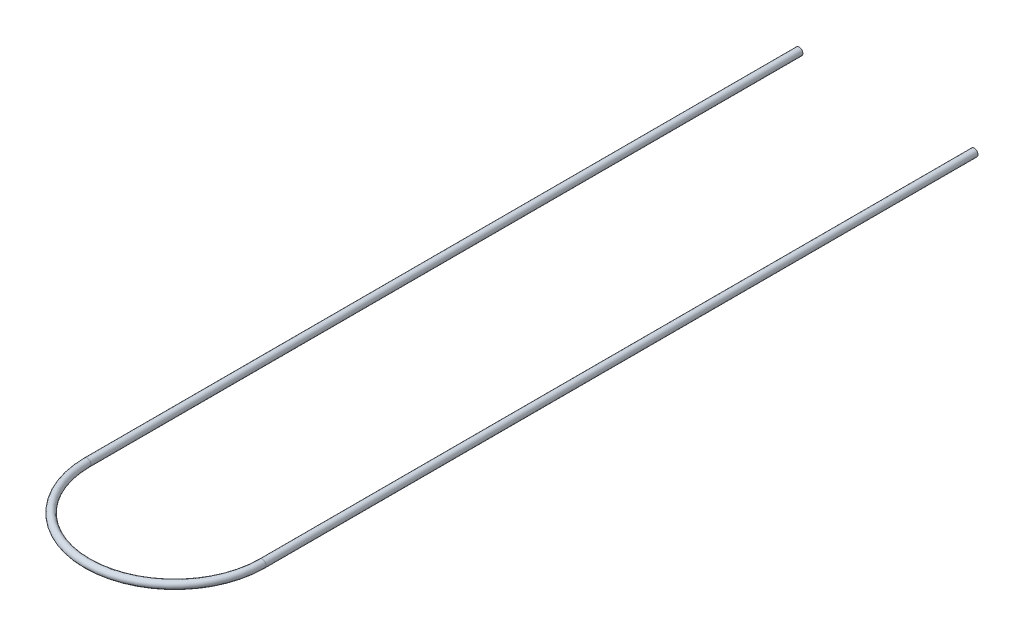
ISO-10303-21;
HEADER;
FILE_DESCRIPTION(('STEP AP214'),'2;1');
FILE_NAME('part.step','',(''),(''),'','','');
FILE_SCHEMA(('AUTOMOTIVE_DESIGN { 1 0 10303 214 1 1 1 1 }'));
ENDSEC;
DATA;
#1=APPLICATION_CONTEXT('core data for automotive mechanical design processes');
#2=APPLICATION_PROTOCOL_DEFINITION('international standard','automotive_design',2000,#1);
#3=PRODUCT_CONTEXT('',#1,'mechanical');
#4=PRODUCT('Part','Part','',(#3));
#5=PRODUCT_RELATED_PRODUCT_CATEGORY('part','',(#4));
#6=PRODUCT_DEFINITION_FORMATION('','',#4);
#7=PRODUCT_DEFINITION_CONTEXT('part definition',#1,'design');
#8=PRODUCT_DEFINITION('design','',#6,#7);
#9=PRODUCT_DEFINITION_SHAPE('','',#8);
#10=(LENGTH_UNIT() NAMED_UNIT(*) SI_UNIT(.MILLI.,.METRE.));
#11=(NAMED_UNIT(*) PLANE_ANGLE_UNIT() SI_UNIT($,.RADIAN.));
#12=(NAMED_UNIT(*) SI_UNIT($,.STERADIAN.) SOLID_ANGLE_UNIT());
#13=UNCERTAINTY_MEASURE_WITH_UNIT(LENGTH_MEASURE(1.E-05),#10,'distance_accuracy_value','');
#14=(GEOMETRIC_REPRESENTATION_CONTEXT(3) GLOBAL_UNCERTAINTY_ASSIGNED_CONTEXT((#13)) GLOBAL_UNIT_ASSIGNED_CONTEXT((#10,
#11,#12)) REPRESENTATION_CONTEXT('',''));
#15=CARTESIAN_POINT('',(0.,0.,0.));
#16=DIRECTION('',(0.,0.,1.));
#17=DIRECTION('',(1.,0.,0.));
#18=AXIS2_PLACEMENT_3D('',#15,#16,#17);
#19=CARTESIAN_POINT('',(-40.,0.,299.999999999999));
#20=DIRECTION('',(0.,0.,1.));
#21=DIRECTION('',(1.,0.,0.));
#22=AXIS2_PLACEMENT_3D('',#19,#20,#21);
#23=CYLINDRICAL_SURFACE('',#22,11.1);
#24=CARTESIAN_POINT('',(-39.9999999999997,0.,2440.));
#25=DIRECTION('',(0.,0.,1.));
#26=DIRECTION('',(1.,0.,0.));
#27=AXIS2_PLACEMENT_3D('',#24,#25,#26);
#28=CIRCLE('',#27,11.1);
#29=CARTESIAN_POINT('',(-51.0999999999997,0.,2440.));
#30=VERTEX_POINT('',#29);
#31=EDGE_CURVE('E54',#30,#30,#28,.T.);
#32=ORIENTED_EDGE('',*,*,#31,.F.);
#33=EDGE_LOOP('',(#32));
#34=FACE_BOUND('',#33,.T.);
#35=CARTESIAN_POINT('',(-40.,0.,299.999999999999));
#36=DIRECTION('',(0.,0.,1.));
#37=DIRECTION('',(1.,0.,0.));
#38=AXIS2_PLACEMENT_3D('',#35,#36,#37);
#39=CIRCLE('',#38,11.1);
#40=CARTESIAN_POINT('',(-28.9,0.,299.999999999999));
#41=VERTEX_POINT('',#40);
#42=EDGE_CURVE('E52',#41,#41,#39,.T.);
#43=ORIENTED_EDGE('',*,*,#42,.T.);
#44=EDGE_LOOP('',(#43));
#45=FACE_BOUND('',#44,.T.);
#46=ADVANCED_FACE('F31',(#34,#45),#23,.T.);
#47=CARTESIAN_POINT('',(223.235,0.,2440.));
#48=DIRECTION('',(0.,1.,0.));
#49=DIRECTION('',(0.,0.,1.));
#50=AXIS2_PLACEMENT_3D('',#47,#48,#49);
#51=TOROIDAL_SURFACE('',#50,263.235,11.1);
#52=CARTESIAN_POINT('',(486.47,0.,2440.));
#53=DIRECTION('',(0.,0.,-1.));
#54=DIRECTION('',(-1.,0.,0.));
#55=AXIS2_PLACEMENT_3D('',#52,#53,#54);
#56=CIRCLE('',#55,11.1);
#57=CARTESIAN_POINT('',(497.57,0.,2440.));
#58=VERTEX_POINT('',#57);
#59=EDGE_CURVE('E35',#58,#58,#56,.T.);
#60=CARTESIAN_POINT('',(223.235,0.,2440.));
#61=DIRECTION('',(0.,1.,0.));
#62=DIRECTION('',(0.,0.,1.));
#63=AXIS2_PLACEMENT_3D('',#60,#61,#62);
#64=CIRCLE('',#63,274.335);
#65=EDGE_CURVE('',#30,#58,#64,.T.);
#66=ORIENTED_EDGE('',*,*,#31,.T.);
#67=ORIENTED_EDGE('',*,*,#59,.F.);
#68=ORIENTED_EDGE('',*,*,#65,.T.);
#69=ORIENTED_EDGE('',*,*,#65,.F.);
#70=EDGE_LOOP('',(#66,#68,#67,#69));
#71=FACE_BOUND('',#70,.T.);
#72=ADVANCED_FACE('F62',(#71),#51,.T.);
#73=CARTESIAN_POINT('',(486.47,0.,2440.));
#74=DIRECTION('',(0.,0.,-1.));
#75=DIRECTION('',(-1.,0.,0.));
#76=AXIS2_PLACEMENT_3D('',#73,#74,#75);
#77=CYLINDRICAL_SURFACE('',#76,11.1);
#78=CARTESIAN_POINT('',(486.47,0.,299.999999999999));
#79=DIRECTION('',(0.,0.,-1.));
#80=DIRECTION('',(-1.,0.,0.));
#81=AXIS2_PLACEMENT_3D('',#78,#79,#80);
#82=CIRCLE('',#81,11.1);
#83=CARTESIAN_POINT('',(475.37,0.,299.999999999999));
#84=VERTEX_POINT('',#83);
#85=EDGE_CURVE('E48',#84,#84,#82,.T.);
#86=ORIENTED_EDGE('',*,*,#85,.F.);
#87=EDGE_LOOP('',(#86));
#88=FACE_BOUND('',#87,.T.);
#89=ORIENTED_EDGE('',*,*,#59,.T.);
#90=EDGE_LOOP('',(#89));
#91=FACE_BOUND('',#90,.T.);
#92=ADVANCED_FACE('F33',(#88,#91),#77,.T.);
#93=CARTESIAN_POINT('',(-40.,0.,299.999999999999));
#94=DIRECTION('',(0.,0.,1.));
#95=DIRECTION('',(1.,0.,0.));
#96=AXIS2_PLACEMENT_3D('',#93,#94,#95);
#97=PLANE('',#96);
#98=CARTESIAN_POINT('',(-40.,0.,299.999999999999));
#99=DIRECTION('',(0.,0.,1.));
#100=DIRECTION('',(1.,0.,0.));
#101=AXIS2_PLACEMENT_3D('',#98,#99,#100);
#102=CIRCLE('',#101,9.95000000000001);
#103=CARTESIAN_POINT('',(-30.05,0.,299.999999999999));
#104=VERTEX_POINT('',#103);
#105=EDGE_CURVE('E51',#104,#104,#102,.F.);
#106=ORIENTED_EDGE('',*,*,#105,.F.);
#107=EDGE_LOOP('',(#106));
#108=FACE_BOUND('',#107,.T.);
#109=ORIENTED_EDGE('',*,*,#42,.F.);
#110=EDGE_LOOP('',(#109));
#111=FACE_BOUND('',#110,.T.);
#112=ADVANCED_FACE('F68',(#108,#111),#97,.F.);
#113=CARTESIAN_POINT('',(486.47,0.,299.999999999999));
#114=DIRECTION('',(0.,0.,-1.));
#115=DIRECTION('',(-1.,0.,0.));
#116=AXIS2_PLACEMENT_3D('',#113,#114,#115);
#117=PLANE('',#116);
#118=CARTESIAN_POINT('',(486.47,0.,299.999999999999));
#119=DIRECTION('',(0.,0.,-1.));
#120=DIRECTION('',(-1.,0.,0.));
#121=AXIS2_PLACEMENT_3D('',#118,#119,#120);
#122=CIRCLE('',#121,9.95000000000001);
#123=CARTESIAN_POINT('',(476.52,0.,299.999999999999));
#124=VERTEX_POINT('',#123);
#125=EDGE_CURVE('E10',#124,#124,#122,.F.);
#126=ORIENTED_EDGE('',*,*,#125,.T.);
#127=EDGE_LOOP('',(#126));
#128=FACE_BOUND('',#127,.T.);
#129=ORIENTED_EDGE('',*,*,#85,.T.);
#130=EDGE_LOOP('',(#129));
#131=FACE_BOUND('',#130,.T.);
#132=ADVANCED_FACE('F86',(#128,#131),#117,.T.);
#133=CARTESIAN_POINT('',(-40.,0.,299.999999999999));
#134=DIRECTION('',(0.,0.,1.));
#135=DIRECTION('',(1.,0.,0.));
#136=AXIS2_PLACEMENT_3D('',#133,#134,#135);
#137=CYLINDRICAL_SURFACE('',#136,9.95000000000001);
#138=CARTESIAN_POINT('',(-39.9999999999997,0.,2440.));
#139=DIRECTION('',(0.,0.,1.));
#140=DIRECTION('',(1.,0.,0.));
#141=AXIS2_PLACEMENT_3D('',#138,#139,#140);
#142=CIRCLE('',#141,9.95000000000001);
#143=CARTESIAN_POINT('',(-49.9499999999997,0.,2440.));
#144=VERTEX_POINT('',#143);
#145=EDGE_CURVE('E44',#144,#144,#142,.F.);
#146=ORIENTED_EDGE('',*,*,#145,.F.);
#147=EDGE_LOOP('',(#146));
#148=FACE_BOUND('',#147,.T.);
#149=ORIENTED_EDGE('',*,*,#105,.T.);
#150=EDGE_LOOP('',(#149));
#151=FACE_BOUND('',#150,.T.);
#152=ADVANCED_FACE('F80',(#148,#151),#137,.F.);
#153=CARTESIAN_POINT('',(223.235,0.,2440.));
#154=DIRECTION('',(0.,1.,0.));
#155=DIRECTION('',(0.,0.,1.));
#156=AXIS2_PLACEMENT_3D('',#153,#154,#155);
#157=TOROIDAL_SURFACE('',#156,263.235,9.95000000000001);
#158=CARTESIAN_POINT('',(486.47,0.,2440.));
#159=DIRECTION('',(0.,0.,-1.));
#160=DIRECTION('',(-1.,0.,0.));
#161=AXIS2_PLACEMENT_3D('',#158,#159,#160);
#162=CIRCLE('',#161,9.95000000000001);
#163=CARTESIAN_POINT('',(496.42,0.,2440.));
#164=VERTEX_POINT('',#163);
#165=EDGE_CURVE('E39',#164,#164,#162,.F.);
#166=CARTESIAN_POINT('',(223.235,0.,2440.));
#167=DIRECTION('',(0.,1.,0.));
#168=DIRECTION('',(0.,0.,1.));
#169=AXIS2_PLACEMENT_3D('',#166,#167,#168);
#170=CIRCLE('',#169,273.185);
#171=EDGE_CURVE('',#144,#164,#170,.T.);
#172=ORIENTED_EDGE('',*,*,#145,.T.);
#173=ORIENTED_EDGE('',*,*,#165,.F.);
#174=ORIENTED_EDGE('',*,*,#171,.T.);
#175=ORIENTED_EDGE('',*,*,#171,.F.);
#176=EDGE_LOOP('',(#172,#174,#173,#175));
#177=FACE_BOUND('',#176,.T.);
#178=ADVANCED_FACE('F74',(#177),#157,.F.);
#179=CARTESIAN_POINT('',(486.47,0.,2440.));
#180=DIRECTION('',(0.,0.,-1.));
#181=DIRECTION('',(-1.,0.,0.));
#182=AXIS2_PLACEMENT_3D('',#179,#180,#181);
#183=CYLINDRICAL_SURFACE('',#182,9.95000000000001);
#184=ORIENTED_EDGE('',*,*,#125,.F.);
#185=EDGE_LOOP('',(#184));
#186=FACE_BOUND('',#185,.T.);
#187=ORIENTED_EDGE('',*,*,#165,.T.);
#188=EDGE_LOOP('',(#187));
#189=FACE_BOUND('',#188,.T.);
#190=ADVANCED_FACE('F72',(#186,#189),#183,.F.);
#191=CLOSED_SHELL('',(#46,#72,#92,#112,#132,#152,#178,#190));
#192=MANIFOLD_SOLID_BREP('B2',#191);
#193=ADVANCED_BREP_SHAPE_REPRESENTATION('',(#18,#192),#14);
#194=SHAPE_DEFINITION_REPRESENTATION(#9,#193);
ENDSEC;
END-ISO-10303-21;
